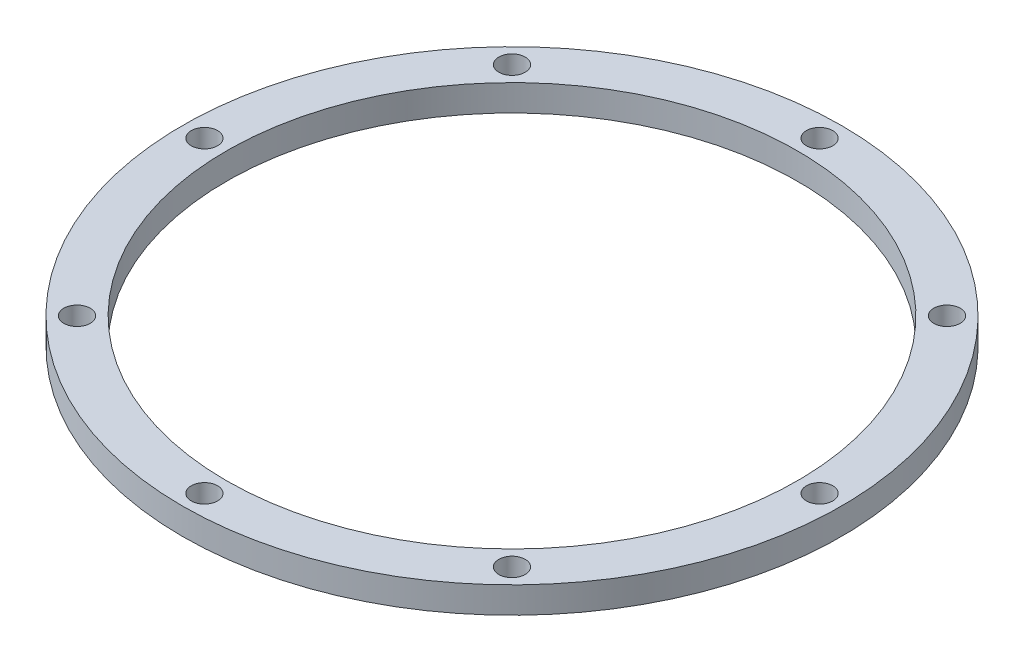
ISO-10303-21;
HEADER;
FILE_DESCRIPTION(('STEP AP214'),'2;1');
FILE_NAME('part.step','',(''),(''),'','','');
FILE_SCHEMA(('AUTOMOTIVE_DESIGN { 1 0 10303 214 1 1 1 1 }'));
ENDSEC;
DATA;
#1=APPLICATION_CONTEXT('core data for automotive mechanical design processes');
#2=APPLICATION_PROTOCOL_DEFINITION('international standard','automotive_design',2000,#1);
#3=PRODUCT_CONTEXT('',#1,'mechanical');
#4=PRODUCT('Part','Part','',(#3));
#5=PRODUCT_RELATED_PRODUCT_CATEGORY('part','',(#4));
#6=PRODUCT_DEFINITION_FORMATION('','',#4);
#7=PRODUCT_DEFINITION_CONTEXT('part definition',#1,'design');
#8=PRODUCT_DEFINITION('design','',#6,#7);
#9=PRODUCT_DEFINITION_SHAPE('','',#8);
#10=(LENGTH_UNIT() NAMED_UNIT(*) SI_UNIT(.MILLI.,.METRE.));
#11=(NAMED_UNIT(*) PLANE_ANGLE_UNIT() SI_UNIT($,.RADIAN.));
#12=(NAMED_UNIT(*) SI_UNIT($,.STERADIAN.) SOLID_ANGLE_UNIT());
#13=UNCERTAINTY_MEASURE_WITH_UNIT(LENGTH_MEASURE(1.E-05),#10,'distance_accuracy_value','');
#14=(GEOMETRIC_REPRESENTATION_CONTEXT(3) GLOBAL_UNCERTAINTY_ASSIGNED_CONTEXT((#13)) GLOBAL_UNIT_ASSIGNED_CONTEXT((#10,
#11,#12)) REPRESENTATION_CONTEXT('',''));
#15=CARTESIAN_POINT('',(0.,0.,0.));
#16=DIRECTION('',(0.,0.,1.));
#17=DIRECTION('',(1.,0.,0.));
#18=AXIS2_PLACEMENT_3D('',#15,#16,#17);
#19=CARTESIAN_POINT('',(0.,6.,0.));
#20=DIRECTION('',(0.,-1.,0.));
#21=DIRECTION('',(0.,0.,-1.));
#22=AXIS2_PLACEMENT_3D('',#19,#20,#21);
#23=CYLINDRICAL_SURFACE('',#22,75.);
#24=CARTESIAN_POINT('',(0.,6.,0.));
#25=DIRECTION('',(0.,1.,0.));
#26=DIRECTION('',(0.,0.,1.));
#27=AXIS2_PLACEMENT_3D('',#24,#25,#26);
#28=CIRCLE('',#27,75.);
#29=CARTESIAN_POINT('',(0.,6.,75.));
#30=VERTEX_POINT('',#29);
#31=EDGE_CURVE('E10',#30,#30,#28,.T.);
#32=ORIENTED_EDGE('',*,*,#31,.F.);
#33=EDGE_LOOP('',(#32));
#34=FACE_BOUND('',#33,.T.);
#35=CARTESIAN_POINT('',(0.,0.,0.));
#36=DIRECTION('',(0.,1.,0.));
#37=DIRECTION('',(0.,0.,1.));
#38=AXIS2_PLACEMENT_3D('',#35,#36,#37);
#39=CIRCLE('',#38,75.);
#40=CARTESIAN_POINT('',(0.,0.,75.));
#41=VERTEX_POINT('',#40);
#42=EDGE_CURVE('E38',#41,#41,#39,.T.);
#43=ORIENTED_EDGE('',*,*,#42,.T.);
#44=EDGE_LOOP('',(#43));
#45=FACE_BOUND('',#44,.T.);
#46=ADVANCED_FACE('F35',(#34,#45),#23,.T.);
#47=CARTESIAN_POINT('',(0.,6.,0.));
#48=DIRECTION('',(0.,1.,0.));
#49=DIRECTION('',(0.,0.,1.));
#50=AXIS2_PLACEMENT_3D('',#47,#48,#49);
#51=PLANE('',#50);
#52=CARTESIAN_POINT('',(0.,6.,0.));
#53=DIRECTION('',(0.,1.,0.));
#54=DIRECTION('',(0.,0.,1.));
#55=AXIS2_PLACEMENT_3D('',#52,#53,#54);
#56=CIRCLE('',#55,65.);
#57=CARTESIAN_POINT('',(0.,6.,65.));
#58=VERTEX_POINT('',#57);
#59=EDGE_CURVE('E95',#58,#58,#56,.T.);
#60=ORIENTED_EDGE('',*,*,#59,.F.);
#61=EDGE_LOOP('',(#60));
#62=FACE_BOUND('',#61,.T.);
#63=CARTESIAN_POINT('',(-70.,6.,0.));
#64=DIRECTION('',(0.,1.,0.));
#65=DIRECTION('',(0.,0.,1.));
#66=AXIS2_PLACEMENT_3D('',#63,#64,#65);
#67=CIRCLE('',#66,3.00000000000001);
#68=CARTESIAN_POINT('',(-70.,6.,3.00000000000001));
#69=VERTEX_POINT('',#68);
#70=EDGE_CURVE('E72',#69,#69,#67,.T.);
#71=ORIENTED_EDGE('',*,*,#70,.F.);
#72=EDGE_LOOP('',(#71));
#73=FACE_BOUND('',#72,.T.);
#74=CARTESIAN_POINT('',(-49.4974746830583,6.,-49.4974746830583));
#75=DIRECTION('',(0.,1.,0.));
#76=DIRECTION('',(0.,0.,-1.));
#77=AXIS2_PLACEMENT_3D('',#74,#75,#76);
#78=CIRCLE('',#77,3.);
#79=CARTESIAN_POINT('',(-49.4974746830583,6.,-52.4974746830583));
#80=VERTEX_POINT('',#79);
#81=EDGE_CURVE('E80',#80,#80,#78,.T.);
#82=ORIENTED_EDGE('',*,*,#81,.F.);
#83=EDGE_LOOP('',(#82));
#84=FACE_BOUND('',#83,.T.);
#85=CARTESIAN_POINT('',(49.4974746830589,6.,49.4974746830578));
#86=DIRECTION('',(0.,1.,0.));
#87=DIRECTION('',(0.,0.,1.));
#88=AXIS2_PLACEMENT_3D('',#85,#86,#87);
#89=CIRCLE('',#88,3.00000000000001);
#90=CARTESIAN_POINT('',(49.4974746830589,6.,52.4974746830578));
#91=VERTEX_POINT('',#90);
#92=EDGE_CURVE('E73',#91,#91,#89,.T.);
#93=ORIENTED_EDGE('',*,*,#92,.F.);
#94=EDGE_LOOP('',(#93));
#95=FACE_BOUND('',#94,.T.);
#96=CARTESIAN_POINT('',(49.4974746830578,6.,-49.4974746830589));
#97=DIRECTION('',(0.,1.,0.));
#98=DIRECTION('',(0.,0.,-1.));
#99=AXIS2_PLACEMENT_3D('',#96,#97,#98);
#100=CIRCLE('',#99,3.);
#101=CARTESIAN_POINT('',(49.4974746830578,6.,-52.4974746830589));
#102=VERTEX_POINT('',#101);
#103=EDGE_CURVE('E85',#102,#102,#100,.T.);
#104=ORIENTED_EDGE('',*,*,#103,.F.);
#105=EDGE_LOOP('',(#104));
#106=FACE_BOUND('',#105,.T.);
#107=CARTESIAN_POINT('',(-49.4974746830583,6.,49.4974746830583));
#108=DIRECTION('',(0.,1.,0.));
#109=DIRECTION('',(0.,0.,1.));
#110=AXIS2_PLACEMENT_3D('',#107,#108,#109);
#111=CIRCLE('',#110,3.);
#112=CARTESIAN_POINT('',(-49.4974746830583,6.,52.4974746830583));
#113=VERTEX_POINT('',#112);
#114=EDGE_CURVE('E47',#113,#113,#111,.T.);
#115=ORIENTED_EDGE('',*,*,#114,.F.);
#116=EDGE_LOOP('',(#115));
#117=FACE_BOUND('',#116,.T.);
#118=CARTESIAN_POINT('',(0.,6.,70.));
#119=DIRECTION('',(0.,1.,0.));
#120=DIRECTION('',(0.,0.,1.));
#121=AXIS2_PLACEMENT_3D('',#118,#119,#120);
#122=CIRCLE('',#121,3.);
#123=CARTESIAN_POINT('',(0.,6.,73.));
#124=VERTEX_POINT('',#123);
#125=EDGE_CURVE('E54',#124,#124,#122,.T.);
#126=ORIENTED_EDGE('',*,*,#125,.F.);
#127=EDGE_LOOP('',(#126));
#128=FACE_BOUND('',#127,.T.);
#129=CARTESIAN_POINT('',(0.,6.,-70.));
#130=DIRECTION('',(0.,1.,0.));
#131=DIRECTION('',(0.,0.,-1.));
#132=AXIS2_PLACEMENT_3D('',#129,#130,#131);
#133=CIRCLE('',#132,3.);
#134=CARTESIAN_POINT('',(0.,6.,-73.));
#135=VERTEX_POINT('',#134);
#136=EDGE_CURVE('E60',#135,#135,#133,.T.);
#137=ORIENTED_EDGE('',*,*,#136,.F.);
#138=EDGE_LOOP('',(#137));
#139=FACE_BOUND('',#138,.T.);
#140=CARTESIAN_POINT('',(70.,6.,0.));
#141=DIRECTION('',(0.,1.,0.));
#142=DIRECTION('',(0.,0.,-1.));
#143=AXIS2_PLACEMENT_3D('',#140,#141,#142);
#144=CIRCLE('',#143,3.00000000000001);
#145=CARTESIAN_POINT('',(70.,6.,-3.00000000000003));
#146=VERTEX_POINT('',#145);
#147=EDGE_CURVE('E66',#146,#146,#144,.T.);
#148=ORIENTED_EDGE('',*,*,#147,.F.);
#149=EDGE_LOOP('',(#148));
#150=FACE_BOUND('',#149,.T.);
#151=ORIENTED_EDGE('',*,*,#31,.T.);
#152=EDGE_LOOP('',(#151));
#153=FACE_BOUND('',#152,.T.);
#154=ADVANCED_FACE('F111',(#62,#73,#84,#95,#106,#117,#128,#139,#150,#153),#51,.T.);
#155=CARTESIAN_POINT('',(0.,0.,0.));
#156=DIRECTION('',(0.,1.,0.));
#157=DIRECTION('',(0.,0.,1.));
#158=AXIS2_PLACEMENT_3D('',#155,#156,#157);
#159=PLANE('',#158);
#160=CARTESIAN_POINT('',(0.,0.,0.));
#161=DIRECTION('',(0.,1.,0.));
#162=DIRECTION('',(0.,0.,1.));
#163=AXIS2_PLACEMENT_3D('',#160,#161,#162);
#164=CIRCLE('',#163,65.);
#165=CARTESIAN_POINT('',(0.,0.,65.));
#166=VERTEX_POINT('',#165);
#167=EDGE_CURVE('E88',#166,#166,#164,.T.);
#168=ORIENTED_EDGE('',*,*,#167,.T.);
#169=EDGE_LOOP('',(#168));
#170=FACE_BOUND('',#169,.T.);
#171=CARTESIAN_POINT('',(-70.,0.,0.));
#172=DIRECTION('',(0.,1.,0.));
#173=DIRECTION('',(0.,0.,1.));
#174=AXIS2_PLACEMENT_3D('',#171,#172,#173);
#175=CIRCLE('',#174,3.00000000000001);
#176=CARTESIAN_POINT('',(-70.,0.,3.00000000000001));
#177=VERTEX_POINT('',#176);
#178=EDGE_CURVE('E45',#177,#177,#175,.T.);
#179=ORIENTED_EDGE('',*,*,#178,.T.);
#180=EDGE_LOOP('',(#179));
#181=FACE_BOUND('',#180,.T.);
#182=CARTESIAN_POINT('',(-49.4974746830583,0.,-49.4974746830583));
#183=DIRECTION('',(0.,1.,0.));
#184=DIRECTION('',(0.,0.,-1.));
#185=AXIS2_PLACEMENT_3D('',#182,#183,#184);
#186=CIRCLE('',#185,3.);
#187=CARTESIAN_POINT('',(-49.4974746830583,0.,-52.4974746830583));
#188=VERTEX_POINT('',#187);
#189=EDGE_CURVE('E51',#188,#188,#186,.T.);
#190=ORIENTED_EDGE('',*,*,#189,.T.);
#191=EDGE_LOOP('',(#190));
#192=FACE_BOUND('',#191,.T.);
#193=CARTESIAN_POINT('',(49.4974746830589,0.,49.4974746830578));
#194=DIRECTION('',(0.,1.,0.));
#195=DIRECTION('',(0.,0.,1.));
#196=AXIS2_PLACEMENT_3D('',#193,#194,#195);
#197=CIRCLE('',#196,3.00000000000001);
#198=CARTESIAN_POINT('',(49.4974746830589,0.,52.4974746830578));
#199=VERTEX_POINT('',#198);
#200=EDGE_CURVE('E76',#199,#199,#197,.T.);
#201=ORIENTED_EDGE('',*,*,#200,.T.);
#202=EDGE_LOOP('',(#201));
#203=FACE_BOUND('',#202,.T.);
#204=CARTESIAN_POINT('',(49.4974746830578,0.,-49.4974746830589));
#205=DIRECTION('',(0.,1.,0.));
#206=DIRECTION('',(0.,0.,-1.));
#207=AXIS2_PLACEMENT_3D('',#204,#205,#206);
#208=CIRCLE('',#207,3.);
#209=CARTESIAN_POINT('',(49.4974746830578,0.,-52.4974746830589));
#210=VERTEX_POINT('',#209);
#211=EDGE_CURVE('E77',#210,#210,#208,.T.);
#212=ORIENTED_EDGE('',*,*,#211,.T.);
#213=EDGE_LOOP('',(#212));
#214=FACE_BOUND('',#213,.T.);
#215=CARTESIAN_POINT('',(-49.4974746830583,0.,49.4974746830583));
#216=DIRECTION('',(0.,1.,0.));
#217=DIRECTION('',(0.,0.,1.));
#218=AXIS2_PLACEMENT_3D('',#215,#216,#217);
#219=CIRCLE('',#218,3.);
#220=CARTESIAN_POINT('',(-49.4974746830583,0.,52.4974746830583));
#221=VERTEX_POINT('',#220);
#222=EDGE_CURVE('E50',#221,#221,#219,.T.);
#223=ORIENTED_EDGE('',*,*,#222,.T.);
#224=EDGE_LOOP('',(#223));
#225=FACE_BOUND('',#224,.T.);
#226=CARTESIAN_POINT('',(0.,0.,70.));
#227=DIRECTION('',(0.,1.,0.));
#228=DIRECTION('',(0.,0.,1.));
#229=AXIS2_PLACEMENT_3D('',#226,#227,#228);
#230=CIRCLE('',#229,3.);
#231=CARTESIAN_POINT('',(0.,0.,73.));
#232=VERTEX_POINT('',#231);
#233=EDGE_CURVE('E57',#232,#232,#230,.T.);
#234=ORIENTED_EDGE('',*,*,#233,.T.);
#235=EDGE_LOOP('',(#234));
#236=FACE_BOUND('',#235,.T.);
#237=CARTESIAN_POINT('',(0.,0.,-70.));
#238=DIRECTION('',(0.,1.,0.));
#239=DIRECTION('',(0.,0.,-1.));
#240=AXIS2_PLACEMENT_3D('',#237,#238,#239);
#241=CIRCLE('',#240,3.);
#242=CARTESIAN_POINT('',(0.,0.,-73.));
#243=VERTEX_POINT('',#242);
#244=EDGE_CURVE('E63',#243,#243,#241,.T.);
#245=ORIENTED_EDGE('',*,*,#244,.T.);
#246=EDGE_LOOP('',(#245));
#247=FACE_BOUND('',#246,.T.);
#248=CARTESIAN_POINT('',(70.,0.,0.));
#249=DIRECTION('',(0.,1.,0.));
#250=DIRECTION('',(0.,0.,-1.));
#251=AXIS2_PLACEMENT_3D('',#248,#249,#250);
#252=CIRCLE('',#251,3.00000000000001);
#253=CARTESIAN_POINT('',(70.,0.,-3.00000000000003));
#254=VERTEX_POINT('',#253);
#255=EDGE_CURVE('E69',#254,#254,#252,.T.);
#256=ORIENTED_EDGE('',*,*,#255,.T.);
#257=EDGE_LOOP('',(#256));
#258=FACE_BOUND('',#257,.T.);
#259=ORIENTED_EDGE('',*,*,#42,.F.);
#260=EDGE_LOOP('',(#259));
#261=FACE_BOUND('',#260,.T.);
#262=ADVANCED_FACE('F101',(#170,#181,#192,#203,#214,#225,#236,#247,#258,#261),#159,.F.);
#263=CARTESIAN_POINT('',(70.,0.,0.));
#264=DIRECTION('',(0.,1.,0.));
#265=DIRECTION('',(0.,0.,1.));
#266=AXIS2_PLACEMENT_3D('',#263,#264,#265);
#267=CYLINDRICAL_SURFACE('',#266,3.00000000000001);
#268=ORIENTED_EDGE('',*,*,#255,.F.);
#269=EDGE_LOOP('',(#268));
#270=FACE_BOUND('',#269,.T.);
#271=ORIENTED_EDGE('',*,*,#147,.T.);
#272=EDGE_LOOP('',(#271));
#273=FACE_BOUND('',#272,.T.);
#274=ADVANCED_FACE('F131',(#270,#273),#267,.F.);
#275=CARTESIAN_POINT('',(0.,0.,-70.));
#276=DIRECTION('',(0.,1.,0.));
#277=DIRECTION('',(0.,0.,1.));
#278=AXIS2_PLACEMENT_3D('',#275,#276,#277);
#279=CYLINDRICAL_SURFACE('',#278,3.);
#280=ORIENTED_EDGE('',*,*,#244,.F.);
#281=EDGE_LOOP('',(#280));
#282=FACE_BOUND('',#281,.T.);
#283=ORIENTED_EDGE('',*,*,#136,.T.);
#284=EDGE_LOOP('',(#283));
#285=FACE_BOUND('',#284,.T.);
#286=ADVANCED_FACE('F133',(#282,#285),#279,.F.);
#287=CARTESIAN_POINT('',(0.,0.,70.));
#288=DIRECTION('',(0.,1.,0.));
#289=DIRECTION('',(0.,0.,1.));
#290=AXIS2_PLACEMENT_3D('',#287,#288,#289);
#291=CYLINDRICAL_SURFACE('',#290,3.);
#292=ORIENTED_EDGE('',*,*,#233,.F.);
#293=EDGE_LOOP('',(#292));
#294=FACE_BOUND('',#293,.T.);
#295=ORIENTED_EDGE('',*,*,#125,.T.);
#296=EDGE_LOOP('',(#295));
#297=FACE_BOUND('',#296,.T.);
#298=ADVANCED_FACE('F140',(#294,#297),#291,.F.);
#299=CARTESIAN_POINT('',(-49.4974746830583,0.,49.4974746830583));
#300=DIRECTION('',(0.,1.,0.));
#301=DIRECTION('',(0.,0.,1.));
#302=AXIS2_PLACEMENT_3D('',#299,#300,#301);
#303=CYLINDRICAL_SURFACE('',#302,3.);
#304=ORIENTED_EDGE('',*,*,#222,.F.);
#305=EDGE_LOOP('',(#304));
#306=FACE_BOUND('',#305,.T.);
#307=ORIENTED_EDGE('',*,*,#114,.T.);
#308=EDGE_LOOP('',(#307));
#309=FACE_BOUND('',#308,.T.);
#310=ADVANCED_FACE('F198',(#306,#309),#303,.F.);
#311=CARTESIAN_POINT('',(49.4974746830578,0.,-49.4974746830589));
#312=DIRECTION('',(0.,1.,0.));
#313=DIRECTION('',(0.,0.,1.));
#314=AXIS2_PLACEMENT_3D('',#311,#312,#313);
#315=CYLINDRICAL_SURFACE('',#314,3.);
#316=ORIENTED_EDGE('',*,*,#211,.F.);
#317=EDGE_LOOP('',(#316));
#318=FACE_BOUND('',#317,.T.);
#319=ORIENTED_EDGE('',*,*,#103,.T.);
#320=EDGE_LOOP('',(#319));
#321=FACE_BOUND('',#320,.T.);
#322=ADVANCED_FACE('F191',(#318,#321),#315,.F.);
#323=CARTESIAN_POINT('',(49.4974746830589,0.,49.4974746830578));
#324=DIRECTION('',(0.,1.,0.));
#325=DIRECTION('',(0.,0.,1.));
#326=AXIS2_PLACEMENT_3D('',#323,#324,#325);
#327=CYLINDRICAL_SURFACE('',#326,3.00000000000001);
#328=ORIENTED_EDGE('',*,*,#200,.F.);
#329=EDGE_LOOP('',(#328));
#330=FACE_BOUND('',#329,.T.);
#331=ORIENTED_EDGE('',*,*,#92,.T.);
#332=EDGE_LOOP('',(#331));
#333=FACE_BOUND('',#332,.T.);
#334=ADVANCED_FACE('F183',(#330,#333),#327,.F.);
#335=CARTESIAN_POINT('',(-49.4974746830583,0.,-49.4974746830583));
#336=DIRECTION('',(0.,1.,0.));
#337=DIRECTION('',(0.,0.,1.));
#338=AXIS2_PLACEMENT_3D('',#335,#336,#337);
#339=CYLINDRICAL_SURFACE('',#338,3.);
#340=ORIENTED_EDGE('',*,*,#189,.F.);
#341=EDGE_LOOP('',(#340));
#342=FACE_BOUND('',#341,.T.);
#343=ORIENTED_EDGE('',*,*,#81,.T.);
#344=EDGE_LOOP('',(#343));
#345=FACE_BOUND('',#344,.T.);
#346=ADVANCED_FACE('F176',(#342,#345),#339,.F.);
#347=CARTESIAN_POINT('',(-70.,0.,0.));
#348=DIRECTION('',(0.,1.,0.));
#349=DIRECTION('',(0.,0.,1.));
#350=AXIS2_PLACEMENT_3D('',#347,#348,#349);
#351=CYLINDRICAL_SURFACE('',#350,3.00000000000001);
#352=ORIENTED_EDGE('',*,*,#178,.F.);
#353=EDGE_LOOP('',(#352));
#354=FACE_BOUND('',#353,.T.);
#355=ORIENTED_EDGE('',*,*,#70,.T.);
#356=EDGE_LOOP('',(#355));
#357=FACE_BOUND('',#356,.T.);
#358=ADVANCED_FACE('F107',(#354,#357),#351,.F.);
#359=CARTESIAN_POINT('',(0.,0.,0.));
#360=DIRECTION('',(0.,1.,0.));
#361=DIRECTION('',(0.,0.,1.));
#362=AXIS2_PLACEMENT_3D('',#359,#360,#361);
#363=CYLINDRICAL_SURFACE('',#362,65.);
#364=ORIENTED_EDGE('',*,*,#167,.F.);
#365=EDGE_LOOP('',(#364));
#366=FACE_BOUND('',#365,.T.);
#367=ORIENTED_EDGE('',*,*,#59,.T.);
#368=EDGE_LOOP('',(#367));
#369=FACE_BOUND('',#368,.T.);
#370=ADVANCED_FACE('F104',(#366,#369),#363,.F.);
#371=CLOSED_SHELL('',(#46,#154,#262,#274,#286,#298,#310,#322,#334,#346,#358,#370));
#372=MANIFOLD_SOLID_BREP('B2',#371);
#373=ADVANCED_BREP_SHAPE_REPRESENTATION('',(#18,#372),#14);
#374=SHAPE_DEFINITION_REPRESENTATION(#9,#373);
ENDSEC;
END-ISO-10303-21;
